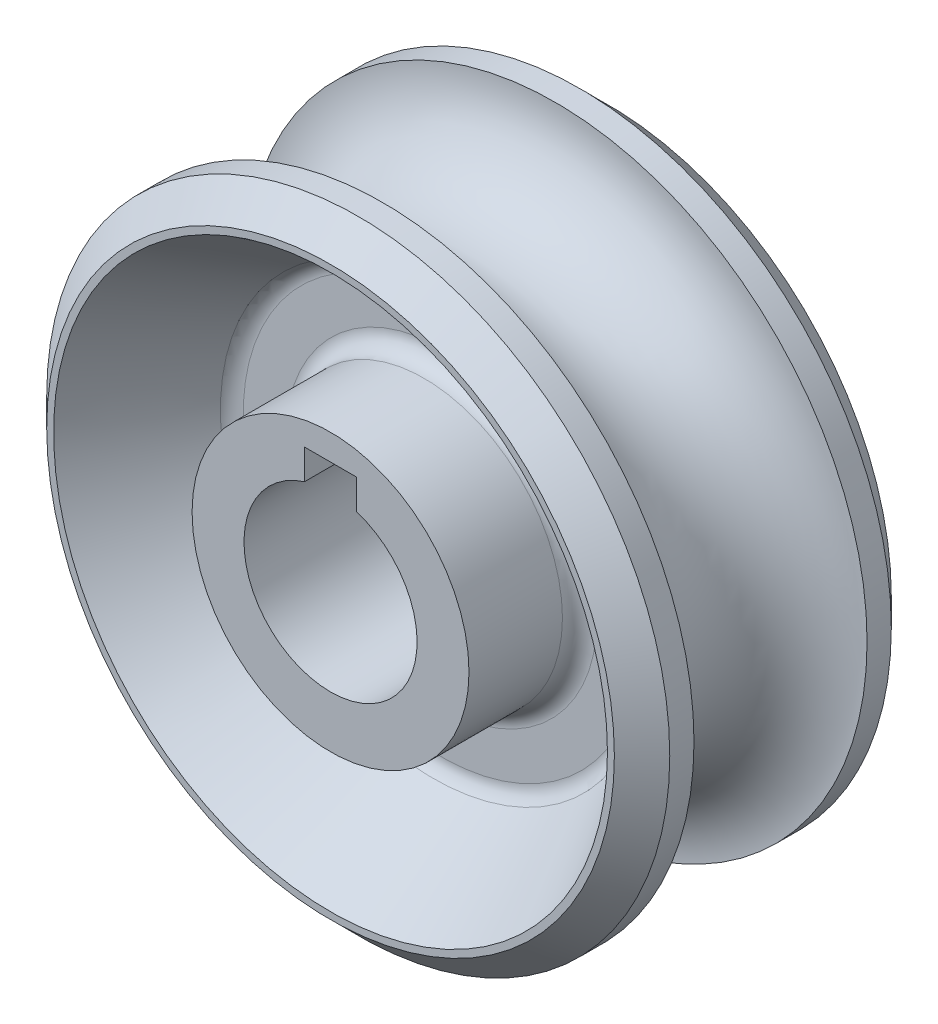
ISO-10303-21;
HEADER;
FILE_DESCRIPTION(('STEP AP214'),'2;1');
FILE_NAME('part.step','',(''),(''),'','','');
FILE_SCHEMA(('AUTOMOTIVE_DESIGN { 1 0 10303 214 1 1 1 1 }'));
ENDSEC;
DATA;
#1=APPLICATION_CONTEXT('core data for automotive mechanical design processes');
#2=APPLICATION_PROTOCOL_DEFINITION('international standard','automotive_design',2000,#1);
#3=PRODUCT_CONTEXT('',#1,'mechanical');
#4=PRODUCT('Part','Part','',(#3));
#5=PRODUCT_RELATED_PRODUCT_CATEGORY('part','',(#4));
#6=PRODUCT_DEFINITION_FORMATION('','',#4);
#7=PRODUCT_DEFINITION_CONTEXT('part definition',#1,'design');
#8=PRODUCT_DEFINITION('design','',#6,#7);
#9=PRODUCT_DEFINITION_SHAPE('','',#8);
#10=(LENGTH_UNIT() NAMED_UNIT(*) SI_UNIT(.MILLI.,.METRE.));
#11=(NAMED_UNIT(*) PLANE_ANGLE_UNIT() SI_UNIT($,.RADIAN.));
#12=(NAMED_UNIT(*) SI_UNIT($,.STERADIAN.) SOLID_ANGLE_UNIT());
#13=UNCERTAINTY_MEASURE_WITH_UNIT(LENGTH_MEASURE(1.E-05),#10,'distance_accuracy_value','');
#14=(GEOMETRIC_REPRESENTATION_CONTEXT(3) GLOBAL_UNCERTAINTY_ASSIGNED_CONTEXT((#13)) GLOBAL_UNIT_ASSIGNED_CONTEXT((#10,
#11,#12)) REPRESENTATION_CONTEXT('',''));
#15=CARTESIAN_POINT('',(0.,0.,0.));
#16=DIRECTION('',(0.,0.,1.));
#17=DIRECTION('',(1.,0.,0.));
#18=AXIS2_PLACEMENT_3D('',#15,#16,#17);
#19=CARTESIAN_POINT('',(0.,0.,12.7));
#20=DIRECTION('',(0.,0.,-1.));
#21=DIRECTION('',(-1.,0.,0.));
#22=AXIS2_PLACEMENT_3D('',#19,#20,#21);
#23=CYLINDRICAL_SURFACE('',#22,28.575);
#24=CARTESIAN_POINT('',(0.,0.,10.16));
#25=DIRECTION('',(0.,0.,1.));
#26=DIRECTION('',(1.,0.,0.));
#27=AXIS2_PLACEMENT_3D('',#24,#25,#26);
#28=CIRCLE('',#27,28.575);
#29=CARTESIAN_POINT('',(28.575,0.,10.16));
#30=VERTEX_POINT('',#29);
#31=EDGE_CURVE('E170',#30,#30,#28,.F.);
#32=ORIENTED_EDGE('',*,*,#31,.T.);
#33=EDGE_LOOP('',(#32));
#34=FACE_BOUND('',#33,.T.);
#35=CARTESIAN_POINT('',(0.,0.,7.9375));
#36=DIRECTION('',(0.,0.,-1.));
#37=DIRECTION('',(-1.,0.,0.));
#38=AXIS2_PLACEMENT_3D('',#35,#36,#37);
#39=CIRCLE('',#38,28.575);
#40=CARTESIAN_POINT('',(-28.575,0.,7.9375));
#41=VERTEX_POINT('',#40);
#42=EDGE_CURVE('E152',#41,#41,#39,.T.);
#43=ORIENTED_EDGE('',*,*,#42,.F.);
#44=EDGE_LOOP('',(#43));
#45=FACE_BOUND('',#44,.T.);
#46=ADVANCED_FACE('F47',(#34,#45),#23,.T.);
#47=CARTESIAN_POINT('',(0.,0.,-10.16));
#48=DIRECTION('',(0.,0.,1.));
#49=DIRECTION('',(1.,0.,0.));
#50=AXIS2_PLACEMENT_3D('',#47,#48,#49);
#51=CIRCLE('',#50,28.575);
#52=CARTESIAN_POINT('',(28.575,0.,-10.16));
#53=VERTEX_POINT('',#52);
#54=EDGE_CURVE('E147',#53,#53,#51,.T.);
#55=ORIENTED_EDGE('',*,*,#54,.T.);
#56=EDGE_LOOP('',(#55));
#57=FACE_BOUND('',#56,.T.);
#58=CARTESIAN_POINT('',(0.,0.,-7.9375));
#59=DIRECTION('',(0.,0.,1.));
#60=DIRECTION('',(1.,0.,0.));
#61=AXIS2_PLACEMENT_3D('',#58,#59,#60);
#62=CIRCLE('',#61,28.575);
#63=CARTESIAN_POINT('',(28.575,0.,-7.9375));
#64=VERTEX_POINT('',#63);
#65=EDGE_CURVE('E137',#64,#64,#62,.T.);
#66=ORIENTED_EDGE('',*,*,#65,.F.);
#67=EDGE_LOOP('',(#66));
#68=FACE_BOUND('',#67,.T.);
#69=ADVANCED_FACE('F232',(#57,#68),#23,.T.);
#70=CARTESIAN_POINT('',(0.,0.,12.7));
#71=DIRECTION('',(0.,0.,1.));
#72=DIRECTION('',(1.,0.,0.));
#73=AXIS2_PLACEMENT_3D('',#70,#71,#72);
#74=PLANE('',#73);
#75=CARTESIAN_POINT('',(0.,0.,12.7));
#76=DIRECTION('',(0.,0.,1.));
#77=DIRECTION('',(1.,0.,0.));
#78=AXIS2_PLACEMENT_3D('',#75,#76,#77);
#79=CIRCLE('',#78,26.035);
#80=CARTESIAN_POINT('',(26.035,0.,12.7));
#81=VERTEX_POINT('',#80);
#82=EDGE_CURVE('E166',#81,#81,#79,.T.);
#83=ORIENTED_EDGE('',*,*,#82,.T.);
#84=EDGE_LOOP('',(#83));
#85=FACE_BOUND('',#84,.T.);
#86=CARTESIAN_POINT('',(0.,0.,12.7));
#87=DIRECTION('',(0.,0.,1.));
#88=DIRECTION('',(1.,0.,0.));
#89=AXIS2_PLACEMENT_3D('',#86,#87,#88);
#90=CIRCLE('',#89,25.4);
#91=CARTESIAN_POINT('',(25.4,0.,12.7));
#92=VERTEX_POINT('',#91);
#93=EDGE_CURVE('E127',#92,#92,#90,.T.);
#94=ORIENTED_EDGE('',*,*,#93,.F.);
#95=EDGE_LOOP('',(#94));
#96=FACE_BOUND('',#95,.T.);
#97=ADVANCED_FACE('F239',(#85,#96),#74,.T.);
#98=CARTESIAN_POINT('',(0.,0.,-12.7));
#99=DIRECTION('',(0.,0.,1.));
#100=DIRECTION('',(1.,0.,0.));
#101=AXIS2_PLACEMENT_3D('',#98,#99,#100);
#102=PLANE('',#101);
#103=CARTESIAN_POINT('',(0.,0.,-12.7));
#104=DIRECTION('',(0.,0.,1.));
#105=DIRECTION('',(1.,0.,0.));
#106=AXIS2_PLACEMENT_3D('',#103,#104,#105);
#107=CIRCLE('',#106,26.035);
#108=CARTESIAN_POINT('',(26.035,0.,-12.7));
#109=VERTEX_POINT('',#108);
#110=EDGE_CURVE('E162',#109,#109,#107,.F.);
#111=ORIENTED_EDGE('',*,*,#110,.T.);
#112=EDGE_LOOP('',(#111));
#113=FACE_BOUND('',#112,.T.);
#114=CARTESIAN_POINT('',(0.,0.,-12.7));
#115=DIRECTION('',(0.,0.,1.));
#116=DIRECTION('',(1.,0.,0.));
#117=AXIS2_PLACEMENT_3D('',#114,#115,#116);
#118=CIRCLE('',#117,25.4);
#119=CARTESIAN_POINT('',(25.4,0.,-12.7));
#120=VERTEX_POINT('',#119);
#121=EDGE_CURVE('E128',#120,#120,#118,.T.);
#122=ORIENTED_EDGE('',*,*,#121,.T.);
#123=EDGE_LOOP('',(#122));
#124=FACE_BOUND('',#123,.T.);
#125=ADVANCED_FACE('F243',(#113,#124),#102,.F.);
#126=CARTESIAN_POINT('',(0.,0.,0.));
#127=DIRECTION('',(0.,0.,1.));
#128=DIRECTION('',(1.,0.,0.));
#129=AXIS2_PLACEMENT_3D('',#126,#127,#128);
#130=TOROIDAL_SURFACE('',#129,28.575,7.9375);
#131=ORIENTED_EDGE('',*,*,#65,.T.);
#132=EDGE_LOOP('',(#131));
#133=FACE_BOUND('',#132,.T.);
#134=ORIENTED_EDGE('',*,*,#42,.T.);
#135=EDGE_LOOP('',(#134));
#136=FACE_BOUND('',#135,.T.);
#137=ADVANCED_FACE('F291',(#133,#136),#130,.F.);
#138=CARTESIAN_POINT('',(0.,0.,0.));
#139=DIRECTION('',(0.,0.,1.));
#140=DIRECTION('',(1.,0.,0.));
#141=AXIS2_PLACEMENT_3D('',#138,#139,#140);
#142=CYLINDRICAL_SURFACE('',#141,12.7);
#143=CARTESIAN_POINT('',(0.,0.,-4.1275));
#144=DIRECTION('',(0.,0.,-1.));
#145=DIRECTION('',(-1.,0.,0.));
#146=AXIS2_PLACEMENT_3D('',#143,#144,#145);
#147=CIRCLE('',#146,12.7);
#148=CARTESIAN_POINT('',(-12.7,0.,-4.1275));
#149=VERTEX_POINT('',#148);
#150=EDGE_CURVE('E186',#149,#149,#147,.T.);
#151=ORIENTED_EDGE('',*,*,#150,.T.);
#152=EDGE_LOOP('',(#151));
#153=FACE_BOUND('',#152,.T.);
#154=CARTESIAN_POINT('',(0.,0.,-12.7));
#155=DIRECTION('',(0.,0.,1.));
#156=DIRECTION('',(1.,0.,0.));
#157=AXIS2_PLACEMENT_3D('',#154,#155,#156);
#158=CIRCLE('',#157,12.7);
#159=CARTESIAN_POINT('',(12.7,0.,-12.7));
#160=VERTEX_POINT('',#159);
#161=EDGE_CURVE('E132',#160,#160,#158,.T.);
#162=ORIENTED_EDGE('',*,*,#161,.T.);
#163=EDGE_LOOP('',(#162));
#164=FACE_BOUND('',#163,.T.);
#165=ADVANCED_FACE('F299',(#153,#164),#142,.T.);
#166=CARTESIAN_POINT('',(0.,19.05,-2.54));
#167=DIRECTION('',(0.,0.,-1.));
#168=DIRECTION('',(-1.,0.,0.));
#169=AXIS2_PLACEMENT_3D('',#166,#167,#168);
#170=PLANE('',#169);
#171=CARTESIAN_POINT('',(0.,0.,-2.54));
#172=DIRECTION('',(0.,0.,-1.));
#173=DIRECTION('',(-1.,0.,0.));
#174=AXIS2_PLACEMENT_3D('',#171,#172,#173);
#175=CIRCLE('',#174,18.1701318691075);
#176=CARTESIAN_POINT('',(-18.1701318691075,0.,-2.54));
#177=VERTEX_POINT('',#176);
#178=EDGE_CURVE('E182',#177,#177,#175,.T.);
#179=ORIENTED_EDGE('',*,*,#178,.T.);
#180=EDGE_LOOP('',(#179));
#181=FACE_BOUND('',#180,.T.);
#182=CARTESIAN_POINT('',(0.,0.,-2.54));
#183=DIRECTION('',(0.,0.,-1.));
#184=DIRECTION('',(-1.,0.,0.));
#185=AXIS2_PLACEMENT_3D('',#182,#183,#184);
#186=CIRCLE('',#185,14.2875);
#187=CARTESIAN_POINT('',(-14.2875,0.,-2.54));
#188=VERTEX_POINT('',#187);
#189=EDGE_CURVE('E178',#188,#188,#186,.F.);
#190=ORIENTED_EDGE('',*,*,#189,.T.);
#191=EDGE_LOOP('',(#190));
#192=FACE_BOUND('',#191,.T.);
#193=ADVANCED_FACE('F283',(#181,#192),#170,.T.);
#194=CARTESIAN_POINT('',(0.,0.,-12.7));
#195=DIRECTION('',(0.,0.,-1.));
#196=DIRECTION('',(-1.,0.,0.));
#197=AXIS2_PLACEMENT_3D('',#194,#195,#196);
#198=CONICAL_SURFACE('',#197,25.4,0.558599315343562);
#199=CARTESIAN_POINT('',(0.,0.,-3.28612668274495));
#200=DIRECTION('',(0.,0.,-1.));
#201=DIRECTION('',(-1.,0.,0.));
#202=AXIS2_PLACEMENT_3D('',#199,#200,#201);
#203=CIRCLE('',#202,19.5163291767156);
#204=CARTESIAN_POINT('',(-19.5163291767156,0.,-3.28612668274495));
#205=VERTEX_POINT('',#204);
#206=EDGE_CURVE('E174',#205,#205,#203,.F.);
#207=ORIENTED_EDGE('',*,*,#206,.T.);
#208=EDGE_LOOP('',(#207));
#209=FACE_BOUND('',#208,.T.);
#210=ORIENTED_EDGE('',*,*,#121,.F.);
#211=EDGE_LOOP('',(#210));
#212=FACE_BOUND('',#211,.T.);
#213=ADVANCED_FACE('F276',(#209,#212),#198,.F.);
#214=DIRECTION('',(0.,-1.,0.));
#215=VECTOR('',#214,1.);
#216=CARTESIAN_POINT('',(-2.3876,0.,12.7));
#217=LINE('',#216,#215);
#218=CARTESIAN_POINT('',(-2.3876,10.3251,12.7));
#219=VERTEX_POINT('',#218);
#220=CARTESIAN_POINT('',(-2.3876,7.56989250187874,12.7));
#221=VERTEX_POINT('',#220);
#222=EDGE_CURVE('E101',#219,#221,#217,.T.);
#223=ORIENTED_EDGE('',*,*,#222,.F.);
#224=DIRECTION('',(-1.,0.,0.));
#225=VECTOR('',#224,1.);
#226=CARTESIAN_POINT('',(-2.3876,10.3251,12.7));
#227=LINE('',#226,#225);
#228=CARTESIAN_POINT('',(2.3876,10.3251,12.7));
#229=VERTEX_POINT('',#228);
#230=EDGE_CURVE('E100',#229,#219,#227,.T.);
#231=ORIENTED_EDGE('',*,*,#230,.F.);
#232=DIRECTION('',(0.,1.,0.));
#233=VECTOR('',#232,1.);
#234=CARTESIAN_POINT('',(2.3876,0.,12.7));
#235=LINE('',#234,#233);
#236=CARTESIAN_POINT('',(2.3876,7.56989250187874,12.7));
#237=VERTEX_POINT('',#236);
#238=EDGE_CURVE('E90',#237,#229,#235,.T.);
#239=ORIENTED_EDGE('',*,*,#238,.F.);
#240=CARTESIAN_POINT('',(0.,0.,12.7));
#241=DIRECTION('',(0.,0.,1.));
#242=DIRECTION('',(1.,0.,0.));
#243=AXIS2_PLACEMENT_3D('',#240,#241,#242);
#244=CIRCLE('',#243,7.9375);
#245=EDGE_CURVE('E144',#221,#237,#244,.T.);
#246=ORIENTED_EDGE('',*,*,#245,.F.);
#247=EDGE_LOOP('',(#223,#231,#239,#246));
#248=FACE_BOUND('',#247,.T.);
#249=CARTESIAN_POINT('',(0.,0.,12.7));
#250=DIRECTION('',(0.,0.,1.));
#251=DIRECTION('',(1.,0.,0.));
#252=AXIS2_PLACEMENT_3D('',#249,#250,#251);
#253=CIRCLE('',#252,12.7);
#254=CARTESIAN_POINT('',(12.7,0.,12.7));
#255=VERTEX_POINT('',#254);
#256=EDGE_CURVE('E133',#255,#255,#253,.T.);
#257=ORIENTED_EDGE('',*,*,#256,.T.);
#258=EDGE_LOOP('',(#257));
#259=FACE_BOUND('',#258,.T.);
#260=ADVANCED_FACE('F109',(#248,#259),#74,.T.);
#261=CARTESIAN_POINT('',(0.,0.,12.7));
#262=DIRECTION('',(0.,0.,-1.));
#263=DIRECTION('',(-1.,0.,0.));
#264=AXIS2_PLACEMENT_3D('',#261,#262,#263);
#265=CYLINDRICAL_SURFACE('',#264,7.9375);
#266=DIRECTION('',(0.,0.,-1.));
#267=VECTOR('',#266,1.);
#268=CARTESIAN_POINT('',(-2.3876,7.56989250187874,12.7));
#269=LINE('',#268,#267);
#270=CARTESIAN_POINT('',(-2.3876,7.56989250187874,-12.7));
#271=VERTEX_POINT('',#270);
#272=EDGE_CURVE('E71',#221,#271,#269,.T.);
#273=ORIENTED_EDGE('',*,*,#272,.F.);
#274=ORIENTED_EDGE('',*,*,#245,.T.);
#275=DIRECTION('',(0.,0.,-1.));
#276=VECTOR('',#275,1.);
#277=CARTESIAN_POINT('',(2.3876,7.56989250187875,12.7));
#278=LINE('',#277,#276);
#279=CARTESIAN_POINT('',(2.3876,7.56989250187874,-12.7));
#280=VERTEX_POINT('',#279);
#281=EDGE_CURVE('E94',#280,#237,#278,.F.);
#282=ORIENTED_EDGE('',*,*,#281,.F.);
#283=CARTESIAN_POINT('',(0.,0.,-12.7));
#284=DIRECTION('',(0.,0.,1.));
#285=DIRECTION('',(1.,0.,0.));
#286=AXIS2_PLACEMENT_3D('',#283,#284,#285);
#287=CIRCLE('',#286,7.9375);
#288=EDGE_CURVE('E148',#271,#280,#287,.T.);
#289=ORIENTED_EDGE('',*,*,#288,.F.);
#290=EDGE_LOOP('',(#273,#274,#282,#289));
#291=FACE_BOUND('',#290,.T.);
#292=ADVANCED_FACE('F275',(#291),#265,.F.);
#293=ORIENTED_EDGE('',*,*,#161,.F.);
#294=EDGE_LOOP('',(#293));
#295=FACE_BOUND('',#294,.T.);
#296=DIRECTION('',(-1.,0.,0.));
#297=VECTOR('',#296,1.);
#298=CARTESIAN_POINT('',(-2.3876,10.3251,-12.7));
#299=LINE('',#298,#297);
#300=CARTESIAN_POINT('',(2.3876,10.3251,-12.7));
#301=VERTEX_POINT('',#300);
#302=CARTESIAN_POINT('',(-2.3876,10.3251,-12.7));
#303=VERTEX_POINT('',#302);
#304=EDGE_CURVE('E63',#301,#303,#299,.T.);
#305=ORIENTED_EDGE('',*,*,#304,.T.);
#306=DIRECTION('',(0.,-1.,0.));
#307=VECTOR('',#306,1.);
#308=CARTESIAN_POINT('',(-2.3876,0.,-12.7));
#309=LINE('',#308,#307);
#310=EDGE_CURVE('E112',#303,#271,#309,.T.);
#311=ORIENTED_EDGE('',*,*,#310,.T.);
#312=ORIENTED_EDGE('',*,*,#288,.T.);
#313=DIRECTION('',(0.,1.,0.));
#314=VECTOR('',#313,1.);
#315=CARTESIAN_POINT('',(2.3876,0.,-12.7));
#316=LINE('',#315,#314);
#317=EDGE_CURVE('E11',#280,#301,#316,.T.);
#318=ORIENTED_EDGE('',*,*,#317,.T.);
#319=EDGE_LOOP('',(#305,#311,#312,#318));
#320=FACE_BOUND('',#319,.T.);
#321=ADVANCED_FACE('F271',(#295,#320),#102,.F.);
#322=CARTESIAN_POINT('',(0.,0.,0.));
#323=DIRECTION('',(0.,0.,1.));
#324=DIRECTION('',(1.,0.,0.));
#325=AXIS2_PLACEMENT_3D('',#322,#323,#324);
#326=CYLINDRICAL_SURFACE('',#325,12.7);
#327=CARTESIAN_POINT('',(0.,0.,4.1275));
#328=DIRECTION('',(0.,0.,1.));
#329=DIRECTION('',(1.,0.,0.));
#330=AXIS2_PLACEMENT_3D('',#327,#328,#329);
#331=CIRCLE('',#330,12.7);
#332=CARTESIAN_POINT('',(12.7,0.,4.1275));
#333=VERTEX_POINT('',#332);
#334=EDGE_CURVE('E190',#333,#333,#331,.T.);
#335=ORIENTED_EDGE('',*,*,#334,.T.);
#336=EDGE_LOOP('',(#335));
#337=FACE_BOUND('',#336,.T.);
#338=ORIENTED_EDGE('',*,*,#256,.F.);
#339=EDGE_LOOP('',(#338));
#340=FACE_BOUND('',#339,.T.);
#341=ADVANCED_FACE('F228',(#337,#340),#326,.T.);
#342=CARTESIAN_POINT('',(0.,0.,2.54));
#343=DIRECTION('',(0.,0.,1.));
#344=DIRECTION('',(1.,0.,0.));
#345=AXIS2_PLACEMENT_3D('',#342,#343,#344);
#346=CONICAL_SURFACE('',#345,19.05,0.558599315343562);
#347=CARTESIAN_POINT('',(0.,0.,3.28612668274495));
#348=DIRECTION('',(0.,0.,1.));
#349=DIRECTION('',(1.,0.,0.));
#350=AXIS2_PLACEMENT_3D('',#347,#348,#349);
#351=CIRCLE('',#350,19.5163291767156);
#352=CARTESIAN_POINT('',(19.5163291767156,0.,3.28612668274495));
#353=VERTEX_POINT('',#352);
#354=EDGE_CURVE('E56',#353,#353,#351,.F.);
#355=ORIENTED_EDGE('',*,*,#354,.T.);
#356=EDGE_LOOP('',(#355));
#357=FACE_BOUND('',#356,.T.);
#358=ORIENTED_EDGE('',*,*,#93,.T.);
#359=EDGE_LOOP('',(#358));
#360=FACE_BOUND('',#359,.T.);
#361=ADVANCED_FACE('F206',(#357,#360),#346,.F.);
#362=CARTESIAN_POINT('',(0.,19.05,2.54));
#363=DIRECTION('',(0.,0.,1.));
#364=DIRECTION('',(1.,0.,0.));
#365=AXIS2_PLACEMENT_3D('',#362,#363,#364);
#366=PLANE('',#365);
#367=CARTESIAN_POINT('',(0.,0.,2.54));
#368=DIRECTION('',(0.,0.,1.));
#369=DIRECTION('',(1.,0.,0.));
#370=AXIS2_PLACEMENT_3D('',#367,#368,#369);
#371=CIRCLE('',#370,14.2875);
#372=CARTESIAN_POINT('',(14.2875,0.,2.54));
#373=VERTEX_POINT('',#372);
#374=EDGE_CURVE('E198',#373,#373,#371,.F.);
#375=ORIENTED_EDGE('',*,*,#374,.T.);
#376=EDGE_LOOP('',(#375));
#377=FACE_BOUND('',#376,.T.);
#378=CARTESIAN_POINT('',(0.,0.,2.54));
#379=DIRECTION('',(0.,0.,1.));
#380=DIRECTION('',(1.,0.,0.));
#381=AXIS2_PLACEMENT_3D('',#378,#379,#380);
#382=CIRCLE('',#381,18.1701318691075);
#383=CARTESIAN_POINT('',(18.1701318691075,0.,2.54));
#384=VERTEX_POINT('',#383);
#385=EDGE_CURVE('E194',#384,#384,#382,.T.);
#386=ORIENTED_EDGE('',*,*,#385,.T.);
#387=EDGE_LOOP('',(#386));
#388=FACE_BOUND('',#387,.T.);
#389=ADVANCED_FACE('F215',(#377,#388),#366,.T.);
#390=CARTESIAN_POINT('',(0.,0.,-10.16));
#391=DIRECTION('',(0.,0.,1.));
#392=DIRECTION('',(1.,0.,0.));
#393=AXIS2_PLACEMENT_3D('',#390,#391,#392);
#394=CONICAL_SURFACE('',#393,28.575,0.78539816339745);
#395=CARTESIAN_POINT('',(26.035,0.,-12.7));
#396=CARTESIAN_POINT('',(26.0614583333333,0.,-12.6735416666667));
#397=CARTESIAN_POINT('',(26.0879166666666,0.,-12.6470833333333));
#398=CARTESIAN_POINT('',(26.1408333333333,0.,-12.5941666666667));
#399=CARTESIAN_POINT('',(26.1672916666666,0.,-12.5677083333333));
#400=CARTESIAN_POINT('',(26.2202083333333,0.,-12.5147916666667));
#401=CARTESIAN_POINT('',(26.2466666666666,0.,-12.4883333333333));
#402=CARTESIAN_POINT('',(26.2995833333333,0.,-12.4354166666667));
#403=CARTESIAN_POINT('',(26.3260416666666,0.,-12.4089583333333));
#404=CARTESIAN_POINT('',(26.3789583333333,0.,-12.3560416666667));
#405=CARTESIAN_POINT('',(26.4054166666666,0.,-12.3295833333333));
#406=CARTESIAN_POINT('',(26.4583333333333,0.,-12.2766666666667));
#407=CARTESIAN_POINT('',(26.4847916666666,0.,-12.2502083333333));
#408=CARTESIAN_POINT('',(26.5377083333333,0.,-12.1972916666667));
#409=CARTESIAN_POINT('',(26.5641666666666,0.,-12.1708333333333));
#410=CARTESIAN_POINT('',(26.6170833333333,0.,-12.1179166666667));
#411=CARTESIAN_POINT('',(26.6435416666666,0.,-12.0914583333333));
#412=CARTESIAN_POINT('',(26.6964583333333,0.,-12.0385416666667));
#413=CARTESIAN_POINT('',(26.7229166666666,0.,-12.0120833333333));
#414=CARTESIAN_POINT('',(26.7758333333333,0.,-11.9591666666667));
#415=CARTESIAN_POINT('',(26.8022916666667,0.,-11.9327083333333));
#416=CARTESIAN_POINT('',(26.8552083333333,0.,-11.8797916666667));
#417=CARTESIAN_POINT('',(26.8816666666666,0.,-11.8533333333333));
#418=CARTESIAN_POINT('',(26.9345833333333,0.,-11.8004166666667));
#419=CARTESIAN_POINT('',(26.9610416666667,0.,-11.7739583333333));
#420=CARTESIAN_POINT('',(27.0139583333333,0.,-11.7210416666667));
#421=CARTESIAN_POINT('',(27.0404166666667,0.,-11.6945833333333));
#422=CARTESIAN_POINT('',(27.0933333333333,0.,-11.6416666666667));
#423=CARTESIAN_POINT('',(27.1197916666667,0.,-11.6152083333333));
#424=CARTESIAN_POINT('',(27.1727083333333,0.,-11.5622916666667));
#425=CARTESIAN_POINT('',(27.1991666666667,0.,-11.5358333333333));
#426=CARTESIAN_POINT('',(27.2520833333333,0.,-11.4829166666667));
#427=CARTESIAN_POINT('',(27.2785416666667,0.,-11.4564583333333));
#428=CARTESIAN_POINT('',(27.3314583333333,0.,-11.4035416666667));
#429=CARTESIAN_POINT('',(27.3579166666667,0.,-11.3770833333333));
#430=CARTESIAN_POINT('',(27.4108333333333,0.,-11.3241666666667));
#431=CARTESIAN_POINT('',(27.4372916666667,0.,-11.2977083333333));
#432=CARTESIAN_POINT('',(27.4902083333333,0.,-11.2447916666667));
#433=CARTESIAN_POINT('',(27.5166666666667,0.,-11.2183333333333));
#434=CARTESIAN_POINT('',(27.5695833333333,0.,-11.1654166666667));
#435=CARTESIAN_POINT('',(27.5960416666667,0.,-11.1389583333333));
#436=CARTESIAN_POINT('',(27.6489583333333,0.,-11.0860416666667));
#437=CARTESIAN_POINT('',(27.6754166666667,0.,-11.0595833333333));
#438=CARTESIAN_POINT('',(27.7283333333333,0.,-11.0066666666667));
#439=CARTESIAN_POINT('',(27.7547916666667,0.,-10.9802083333333));
#440=CARTESIAN_POINT('',(27.8077083333333,0.,-10.9272916666667));
#441=CARTESIAN_POINT('',(27.8341666666667,0.,-10.9008333333333));
#442=CARTESIAN_POINT('',(27.8870833333333,0.,-10.8479166666667));
#443=CARTESIAN_POINT('',(27.9135416666667,0.,-10.8214583333333));
#444=CARTESIAN_POINT('',(27.9664583333333,0.,-10.7685416666667));
#445=CARTESIAN_POINT('',(27.9929166666667,0.,-10.7420833333333));
#446=CARTESIAN_POINT('',(28.0458333333333,0.,-10.6891666666667));
#447=CARTESIAN_POINT('',(28.0722916666667,0.,-10.6627083333333));
#448=CARTESIAN_POINT('',(28.1252083333333,0.,-10.6097916666666));
#449=CARTESIAN_POINT('',(28.1516666666667,0.,-10.5833333333333));
#450=CARTESIAN_POINT('',(28.2045833333333,0.,-10.5304166666666));
#451=CARTESIAN_POINT('',(28.2310416666667,0.,-10.5039583333333));
#452=CARTESIAN_POINT('',(28.2839583333333,0.,-10.4510416666666));
#453=CARTESIAN_POINT('',(28.3104166666667,0.,-10.4245833333333));
#454=CARTESIAN_POINT('',(28.3633333333333,0.,-10.3716666666666));
#455=CARTESIAN_POINT('',(28.3897916666667,0.,-10.3452083333333));
#456=CARTESIAN_POINT('',(28.4427083333333,0.,-10.2922916666666));
#457=CARTESIAN_POINT('',(28.4691666666667,0.,-10.2658333333333));
#458=CARTESIAN_POINT('',(28.5220833333333,0.,-10.2129166666666));
#459=CARTESIAN_POINT('',(28.5485416666667,0.,-10.1864583333333));
#460=CARTESIAN_POINT('',(28.575,0.,-10.16));
#461=B_SPLINE_CURVE_WITH_KNOTS('',3,(#395,#396,#397,#398,#399,#400,#401,#402,#403,#404,#405,
#406,#407,#408,#409,#410,#411,#412,#413,#414,#415,#416,#417,#418,#419,#420,#421,#422,#423,#424,
#425,#426,#427,#428,#429,#430,#431,#432,#433,#434,#435,#436,#437,#438,#439,#440,#441,#442,#443,
#444,#445,#446,#447,#448,#449,#450,#451,#452,#453,#454,#455,#456,#457,#458,#459,#460),
.UNSPECIFIED.,.F.,.F.,(4,2,2,2,2,2,2,2,2,2,2,2,2,2,2,2,2,2,2,2,2,2,2,2,2,2,2,2,2,2,2,2,4),(0.,
0.112253201513365,0.224506403026729,0.336759604540096,0.449012806053461,0.561266007566828,
0.673519209080193,0.785772410593558,0.898025612106924,1.01027881362029,1.12253201513366,
1.23478521664702,1.34703841816039,1.45929161967375,1.57154482118712,1.68379802270048,
1.79605122421385,1.90830442572722,2.02055762724058,2.13281082875394,2.24506403026731,
2.35731723178068,2.46957043329404,2.58182363480741,2.69407683632077,2.80633003783414,
2.91858323934751,3.03083644086087,3.14308964237424,3.2553428438876,3.36759604540097,
3.47984924691433,3.5921024484277),.UNSPECIFIED.);
#462=EDGE_CURVE('BSEAM217',#109,#53,#461,.T.);
#463=ORIENTED_EDGE('',*,*,#110,.F.);
#464=ORIENTED_EDGE('',*,*,#54,.F.);
#465=ORIENTED_EDGE('',*,*,#462,.T.);
#466=ORIENTED_EDGE('',*,*,#462,.F.);
#467=EDGE_LOOP('',(#463,#465,#464,#466));
#468=FACE_BOUND('',#467,.T.);
#469=ADVANCED_FACE('F217',(#468),#394,.T.);
#470=CARTESIAN_POINT('',(0.,0.,12.7));
#471=DIRECTION('',(0.,0.,-1.));
#472=DIRECTION('',(-1.,0.,0.));
#473=AXIS2_PLACEMENT_3D('',#470,#471,#472);
#474=CONICAL_SURFACE('',#473,26.035,0.785398163397446);
#475=ORIENTED_EDGE('',*,*,#31,.F.);
#476=EDGE_LOOP('',(#475));
#477=FACE_BOUND('',#476,.T.);
#478=ORIENTED_EDGE('',*,*,#82,.F.);
#479=EDGE_LOOP('',(#478));
#480=FACE_BOUND('',#479,.T.);
#481=ADVANCED_FACE('F225',(#477,#480),#474,.T.);
#482=CARTESIAN_POINT('',(0.,0.,-4.1275));
#483=DIRECTION('',(0.,0.,-1.));
#484=DIRECTION('',(-1.,0.,0.));
#485=AXIS2_PLACEMENT_3D('',#482,#483,#484);
#486=TOROIDAL_SURFACE('',#485,18.1701318691075,1.5875);
#487=ORIENTED_EDGE('',*,*,#178,.F.);
#488=EDGE_LOOP('',(#487));
#489=FACE_BOUND('',#488,.T.);
#490=ORIENTED_EDGE('',*,*,#206,.F.);
#491=EDGE_LOOP('',(#490));
#492=FACE_BOUND('',#491,.T.);
#493=ADVANCED_FACE('F254',(#489,#492),#486,.F.);
#494=CARTESIAN_POINT('',(0.,0.,-4.1275));
#495=DIRECTION('',(0.,0.,-1.));
#496=DIRECTION('',(-1.,0.,0.));
#497=AXIS2_PLACEMENT_3D('',#494,#495,#496);
#498=TOROIDAL_SURFACE('',#497,14.2875,1.5875);
#499=ORIENTED_EDGE('',*,*,#150,.F.);
#500=EDGE_LOOP('',(#499));
#501=FACE_BOUND('',#500,.T.);
#502=ORIENTED_EDGE('',*,*,#189,.F.);
#503=EDGE_LOOP('',(#502));
#504=FACE_BOUND('',#503,.T.);
#505=ADVANCED_FACE('F257',(#501,#504),#498,.F.);
#506=CARTESIAN_POINT('',(0.,0.,4.1275));
#507=DIRECTION('',(0.,0.,1.));
#508=DIRECTION('',(1.,0.,0.));
#509=AXIS2_PLACEMENT_3D('',#506,#507,#508);
#510=TOROIDAL_SURFACE('',#509,14.2875,1.5875);
#511=ORIENTED_EDGE('',*,*,#374,.F.);
#512=EDGE_LOOP('',(#511));
#513=FACE_BOUND('',#512,.T.);
#514=ORIENTED_EDGE('',*,*,#334,.F.);
#515=EDGE_LOOP('',(#514));
#516=FACE_BOUND('',#515,.T.);
#517=ADVANCED_FACE('F212',(#513,#516),#510,.F.);
#518=CARTESIAN_POINT('',(0.,0.,4.1275));
#519=DIRECTION('',(0.,0.,1.));
#520=DIRECTION('',(1.,0.,0.));
#521=AXIS2_PLACEMENT_3D('',#518,#519,#520);
#522=TOROIDAL_SURFACE('',#521,18.1701318691075,1.5875);
#523=ORIENTED_EDGE('',*,*,#354,.F.);
#524=EDGE_LOOP('',(#523));
#525=FACE_BOUND('',#524,.T.);
#526=ORIENTED_EDGE('',*,*,#385,.F.);
#527=EDGE_LOOP('',(#526));
#528=FACE_BOUND('',#527,.T.);
#529=ADVANCED_FACE('F49',(#525,#528),#522,.F.);
#530=CARTESIAN_POINT('',(-2.3876,0.,-12.7));
#531=DIRECTION('',(-1.,0.,0.));
#532=DIRECTION('',(0.,0.,1.));
#533=AXIS2_PLACEMENT_3D('',#530,#531,#532);
#534=PLANE('',#533);
#535=ORIENTED_EDGE('',*,*,#272,.T.);
#536=ORIENTED_EDGE('',*,*,#310,.F.);
#537=DIRECTION('',(0.,0.,1.));
#538=VECTOR('',#537,1.);
#539=CARTESIAN_POINT('',(-2.3876,10.3251,-12.7));
#540=LINE('',#539,#538);
#541=EDGE_CURVE('E107',#303,#219,#540,.T.);
#542=ORIENTED_EDGE('',*,*,#541,.T.);
#543=ORIENTED_EDGE('',*,*,#222,.T.);
#544=EDGE_LOOP('',(#535,#536,#542,#543));
#545=FACE_BOUND('',#544,.T.);
#546=ADVANCED_FACE('F211',(#545),#534,.F.);
#547=CARTESIAN_POINT('',(-2.3876,10.3251,-12.7));
#548=DIRECTION('',(0.,1.,0.));
#549=DIRECTION('',(-1.,0.,0.));
#550=AXIS2_PLACEMENT_3D('',#547,#548,#549);
#551=PLANE('',#550);
#552=ORIENTED_EDGE('',*,*,#541,.F.);
#553=ORIENTED_EDGE('',*,*,#304,.F.);
#554=DIRECTION('',(0.,0.,1.));
#555=VECTOR('',#554,1.);
#556=CARTESIAN_POINT('',(2.3876,10.3251,-12.7));
#557=LINE('',#556,#555);
#558=EDGE_CURVE('E92',#301,#229,#557,.T.);
#559=ORIENTED_EDGE('',*,*,#558,.T.);
#560=ORIENTED_EDGE('',*,*,#230,.T.);
#561=EDGE_LOOP('',(#552,#553,#559,#560));
#562=FACE_BOUND('',#561,.T.);
#563=ADVANCED_FACE('F104',(#562),#551,.F.);
#564=CARTESIAN_POINT('',(2.3876,0.,-12.7));
#565=DIRECTION('',(1.,0.,0.));
#566=DIRECTION('',(0.,1.,0.));
#567=AXIS2_PLACEMENT_3D('',#564,#565,#566);
#568=PLANE('',#567);
#569=ORIENTED_EDGE('',*,*,#281,.T.);
#570=ORIENTED_EDGE('',*,*,#238,.T.);
#571=ORIENTED_EDGE('',*,*,#558,.F.);
#572=ORIENTED_EDGE('',*,*,#317,.F.);
#573=EDGE_LOOP('',(#569,#570,#571,#572));
#574=FACE_BOUND('',#573,.T.);
#575=ADVANCED_FACE('F91',(#574),#568,.F.);
#576=CLOSED_SHELL('',(#46,#69,#97,#125,#137,#165,#193,#213,#260,#292,#321,#341,#361,#389,#469,
#481,#493,#505,#517,#529,#546,#563,#575));
#577=MANIFOLD_SOLID_BREP('B2',#576);
#578=ADVANCED_BREP_SHAPE_REPRESENTATION('',(#18,#577),#14);
#579=SHAPE_DEFINITION_REPRESENTATION(#9,#578);
ENDSEC;
END-ISO-10303-21;
